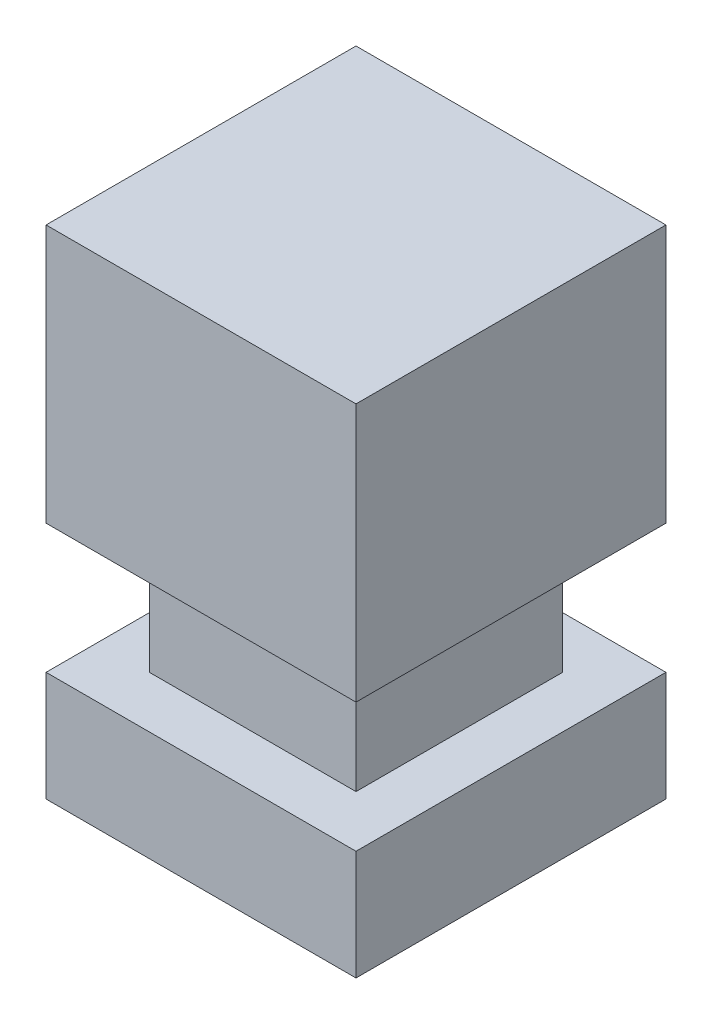
ISO-10303-21;
HEADER;
FILE_DESCRIPTION(('STEP AP214'),'2;1');
FILE_NAME('part.step','',(''),(''),'','','');
FILE_SCHEMA(('AUTOMOTIVE_DESIGN { 1 0 10303 214 1 1 1 1 }'));
ENDSEC;
DATA;
#1=APPLICATION_CONTEXT('core data for automotive mechanical design processes');
#2=APPLICATION_PROTOCOL_DEFINITION('international standard','automotive_design',2000,#1);
#3=PRODUCT_CONTEXT('',#1,'mechanical');
#4=PRODUCT('Part','Part','',(#3));
#5=PRODUCT_RELATED_PRODUCT_CATEGORY('part','',(#4));
#6=PRODUCT_DEFINITION_FORMATION('','',#4);
#7=PRODUCT_DEFINITION_CONTEXT('part definition',#1,'design');
#8=PRODUCT_DEFINITION('design','',#6,#7);
#9=PRODUCT_DEFINITION_SHAPE('','',#8);
#10=(LENGTH_UNIT() NAMED_UNIT(*) SI_UNIT(.MILLI.,.METRE.));
#11=(NAMED_UNIT(*) PLANE_ANGLE_UNIT() SI_UNIT($,.RADIAN.));
#12=(NAMED_UNIT(*) SI_UNIT($,.STERADIAN.) SOLID_ANGLE_UNIT());
#13=UNCERTAINTY_MEASURE_WITH_UNIT(LENGTH_MEASURE(1.E-05),#10,'distance_accuracy_value','');
#14=(GEOMETRIC_REPRESENTATION_CONTEXT(3) GLOBAL_UNCERTAINTY_ASSIGNED_CONTEXT((#13)) GLOBAL_UNIT_ASSIGNED_CONTEXT((#10,
#11,#12)) REPRESENTATION_CONTEXT('',''));
#15=CARTESIAN_POINT('',(0.,0.,0.));
#16=DIRECTION('',(0.,0.,1.));
#17=DIRECTION('',(1.,0.,0.));
#18=AXIS2_PLACEMENT_3D('',#15,#16,#17);
#19=CARTESIAN_POINT('',(-1.2,-3.85,1.2));
#20=DIRECTION('',(0.,0.,1.));
#21=DIRECTION('',(1.,0.,0.));
#22=AXIS2_PLACEMENT_3D('',#19,#20,#21);
#23=PLANE('',#22);
#24=DIRECTION('',(-1.,0.,0.));
#25=VECTOR('',#24,1.);
#26=CARTESIAN_POINT('',(-1.2,-2.,1.2));
#27=LINE('',#26,#25);
#28=CARTESIAN_POINT('',(1.2,-2.,1.2));
#29=VERTEX_POINT('',#28);
#30=CARTESIAN_POINT('',(-1.2,-2.,1.2));
#31=VERTEX_POINT('',#30);
#32=EDGE_CURVE('E234',#29,#31,#27,.T.);
#33=ORIENTED_EDGE('',*,*,#32,.F.);
#34=DIRECTION('',(0.,1.,0.));
#35=VECTOR('',#34,1.);
#36=CARTESIAN_POINT('',(1.2,-3.85,1.2));
#37=LINE('',#36,#35);
#38=CARTESIAN_POINT('',(1.2,0.,1.2));
#39=VERTEX_POINT('',#38);
#40=EDGE_CURVE('E52',#29,#39,#37,.T.);
#41=ORIENTED_EDGE('',*,*,#40,.T.);
#42=DIRECTION('',(1.,0.,0.));
#43=VECTOR('',#42,1.);
#44=CARTESIAN_POINT('',(-1.2,0.,1.2));
#45=LINE('',#44,#43);
#46=CARTESIAN_POINT('',(-1.2,0.,1.2));
#47=VERTEX_POINT('',#46);
#48=EDGE_CURVE('E171',#47,#39,#45,.T.);
#49=ORIENTED_EDGE('',*,*,#48,.F.);
#50=DIRECTION('',(0.,1.,0.));
#51=VECTOR('',#50,1.);
#52=CARTESIAN_POINT('',(-1.2,-3.85,1.2));
#53=LINE('',#52,#51);
#54=EDGE_CURVE('E203',#31,#47,#53,.T.);
#55=ORIENTED_EDGE('',*,*,#54,.F.);
#56=EDGE_LOOP('',(#33,#41,#49,#55));
#57=FACE_BOUND('',#56,.T.);
#58=ADVANCED_FACE('F42',(#57),#23,.T.);
#59=CARTESIAN_POINT('',(1.2,-3.85,1.2));
#60=VERTEX_POINT('',#59);
#61=CARTESIAN_POINT('',(1.2,-3.,1.2));
#62=VERTEX_POINT('',#61);
#63=EDGE_CURVE('E11',#60,#62,#37,.T.);
#64=ORIENTED_EDGE('',*,*,#63,.T.);
#65=DIRECTION('',(1.,0.,0.));
#66=VECTOR('',#65,1.);
#67=CARTESIAN_POINT('',(-1.2,-3.,1.2));
#68=LINE('',#67,#66);
#69=CARTESIAN_POINT('',(-1.2,-3.,1.2));
#70=VERTEX_POINT('',#69);
#71=EDGE_CURVE('E238',#70,#62,#68,.T.);
#72=ORIENTED_EDGE('',*,*,#71,.F.);
#73=CARTESIAN_POINT('',(-1.2,-3.85,1.2));
#74=VERTEX_POINT('',#73);
#75=EDGE_CURVE('E200',#74,#70,#53,.T.);
#76=ORIENTED_EDGE('',*,*,#75,.F.);
#77=DIRECTION('',(1.,0.,0.));
#78=VECTOR('',#77,1.);
#79=CARTESIAN_POINT('',(-1.2,-3.85,1.2));
#80=LINE('',#79,#78);
#81=EDGE_CURVE('E179',#74,#60,#80,.T.);
#82=ORIENTED_EDGE('',*,*,#81,.T.);
#83=EDGE_LOOP('',(#64,#72,#76,#82));
#84=FACE_BOUND('',#83,.T.);
#85=ADVANCED_FACE('F297',(#84),#23,.T.);
#86=CARTESIAN_POINT('',(-1.2,-3.85,-1.2));
#87=DIRECTION('',(0.,0.,-1.));
#88=DIRECTION('',(-1.,0.,0.));
#89=AXIS2_PLACEMENT_3D('',#86,#87,#88);
#90=PLANE('',#89);
#91=DIRECTION('',(0.,1.,0.));
#92=VECTOR('',#91,1.);
#93=CARTESIAN_POINT('',(1.2,-3.85,-1.2));
#94=LINE('',#93,#92);
#95=CARTESIAN_POINT('',(1.2,-2.,-1.2));
#96=VERTEX_POINT('',#95);
#97=CARTESIAN_POINT('',(1.2,0.,-1.2));
#98=VERTEX_POINT('',#97);
#99=EDGE_CURVE('E183',#96,#98,#94,.T.);
#100=ORIENTED_EDGE('',*,*,#99,.F.);
#101=DIRECTION('',(-1.,0.,0.));
#102=VECTOR('',#101,1.);
#103=CARTESIAN_POINT('',(-1.2,-2.,-1.2));
#104=LINE('',#103,#102);
#105=CARTESIAN_POINT('',(-1.2,-2.,-1.2));
#106=VERTEX_POINT('',#105);
#107=EDGE_CURVE('E243',#96,#106,#104,.T.);
#108=ORIENTED_EDGE('',*,*,#107,.T.);
#109=DIRECTION('',(0.,1.,0.));
#110=VECTOR('',#109,1.);
#111=CARTESIAN_POINT('',(-1.2,-3.85,-1.2));
#112=LINE('',#111,#110);
#113=CARTESIAN_POINT('',(-1.2,0.,-1.2));
#114=VERTEX_POINT('',#113);
#115=EDGE_CURVE('E207',#106,#114,#112,.T.);
#116=ORIENTED_EDGE('',*,*,#115,.T.);
#117=DIRECTION('',(-1.,0.,0.));
#118=VECTOR('',#117,1.);
#119=CARTESIAN_POINT('',(-1.2,0.,-1.2));
#120=LINE('',#119,#118);
#121=EDGE_CURVE('E188',#98,#114,#120,.T.);
#122=ORIENTED_EDGE('',*,*,#121,.F.);
#123=EDGE_LOOP('',(#100,#108,#116,#122));
#124=FACE_BOUND('',#123,.T.);
#125=ADVANCED_FACE('F226',(#124),#90,.T.);
#126=DIRECTION('',(1.,0.,0.));
#127=VECTOR('',#126,1.);
#128=CARTESIAN_POINT('',(-1.2,-3.,-1.2));
#129=LINE('',#128,#127);
#130=CARTESIAN_POINT('',(-1.2,-3.,-1.2));
#131=VERTEX_POINT('',#130);
#132=CARTESIAN_POINT('',(1.2,-3.,-1.2));
#133=VERTEX_POINT('',#132);
#134=EDGE_CURVE('E246',#131,#133,#129,.T.);
#135=ORIENTED_EDGE('',*,*,#134,.T.);
#136=CARTESIAN_POINT('',(1.2,-3.85,-1.2));
#137=VERTEX_POINT('',#136);
#138=EDGE_CURVE('E46',#137,#133,#94,.T.);
#139=ORIENTED_EDGE('',*,*,#138,.F.);
#140=DIRECTION('',(-1.,0.,0.));
#141=VECTOR('',#140,1.);
#142=CARTESIAN_POINT('',(-1.2,-3.85,-1.2));
#143=LINE('',#142,#141);
#144=CARTESIAN_POINT('',(-1.2,-3.85,-1.2));
#145=VERTEX_POINT('',#144);
#146=EDGE_CURVE('E170',#137,#145,#143,.T.);
#147=ORIENTED_EDGE('',*,*,#146,.T.);
#148=EDGE_CURVE('E204',#145,#131,#112,.T.);
#149=ORIENTED_EDGE('',*,*,#148,.T.);
#150=EDGE_LOOP('',(#135,#139,#147,#149));
#151=FACE_BOUND('',#150,.T.);
#152=ADVANCED_FACE('F292',(#151),#90,.T.);
#153=CARTESIAN_POINT('',(0.8,-2.,-1.2));
#154=DIRECTION('',(-1.,0.,0.));
#155=DIRECTION('',(0.,-1.,0.));
#156=AXIS2_PLACEMENT_3D('',#153,#154,#155);
#157=PLANE('',#156);
#158=DIRECTION('',(0.,-1.,0.));
#159=VECTOR('',#158,1.);
#160=CARTESIAN_POINT('',(0.8,-2.,-0.8));
#161=LINE('',#160,#159);
#162=CARTESIAN_POINT('',(0.8,-2.,-0.8));
#163=VERTEX_POINT('',#162);
#164=CARTESIAN_POINT('',(0.8,-3.,-0.8));
#165=VERTEX_POINT('',#164);
#166=EDGE_CURVE('E162',#163,#165,#161,.T.);
#167=ORIENTED_EDGE('',*,*,#166,.F.);
#168=DIRECTION('',(0.,0.,1.));
#169=VECTOR('',#168,1.);
#170=CARTESIAN_POINT('',(0.8,-2.,-1.2));
#171=LINE('',#170,#169);
#172=CARTESIAN_POINT('',(0.8,-2.,0.8));
#173=VERTEX_POINT('',#172);
#174=EDGE_CURVE('E150',#163,#173,#171,.T.);
#175=ORIENTED_EDGE('',*,*,#174,.T.);
#176=DIRECTION('',(0.,1.,0.));
#177=VECTOR('',#176,1.);
#178=CARTESIAN_POINT('',(0.8,-2.,0.8));
#179=LINE('',#178,#177);
#180=CARTESIAN_POINT('',(0.799999999999999,-3.,0.799999999999999));
#181=VERTEX_POINT('',#180);
#182=EDGE_CURVE('E135',#181,#173,#179,.T.);
#183=ORIENTED_EDGE('',*,*,#182,.F.);
#184=DIRECTION('',(0.,0.,1.));
#185=VECTOR('',#184,1.);
#186=CARTESIAN_POINT('',(0.799999999999999,-3.,-1.2));
#187=LINE('',#186,#185);
#188=EDGE_CURVE('E148',#165,#181,#187,.T.);
#189=ORIENTED_EDGE('',*,*,#188,.F.);
#190=EDGE_LOOP('',(#167,#175,#183,#189));
#191=FACE_BOUND('',#190,.T.);
#192=ADVANCED_FACE('F147',(#191),#157,.F.);
#193=CARTESIAN_POINT('',(-0.8,-2.,-1.2));
#194=DIRECTION('',(1.,0.,0.));
#195=DIRECTION('',(0.,1.,0.));
#196=AXIS2_PLACEMENT_3D('',#193,#194,#195);
#197=PLANE('',#196);
#198=DIRECTION('',(0.,1.,0.));
#199=VECTOR('',#198,1.);
#200=CARTESIAN_POINT('',(-0.8,-2.,-0.8));
#201=LINE('',#200,#199);
#202=CARTESIAN_POINT('',(-0.8,-3.,-0.8));
#203=VERTEX_POINT('',#202);
#204=CARTESIAN_POINT('',(-0.8,-2.,-0.8));
#205=VERTEX_POINT('',#204);
#206=EDGE_CURVE('E152',#203,#205,#201,.T.);
#207=ORIENTED_EDGE('',*,*,#206,.F.);
#208=DIRECTION('',(0.,0.,1.));
#209=VECTOR('',#208,1.);
#210=CARTESIAN_POINT('',(-0.8,-3.,-1.2));
#211=LINE('',#210,#209);
#212=CARTESIAN_POINT('',(-0.8,-3.,0.799999999999999));
#213=VERTEX_POINT('',#212);
#214=EDGE_CURVE('E252',#203,#213,#211,.T.);
#215=ORIENTED_EDGE('',*,*,#214,.T.);
#216=DIRECTION('',(0.,-1.,0.));
#217=VECTOR('',#216,1.);
#218=CARTESIAN_POINT('',(-0.8,-2.,0.8));
#219=LINE('',#218,#217);
#220=CARTESIAN_POINT('',(-0.8,-2.,0.8));
#221=VERTEX_POINT('',#220);
#222=EDGE_CURVE('E138',#221,#213,#219,.T.);
#223=ORIENTED_EDGE('',*,*,#222,.F.);
#224=DIRECTION('',(0.,0.,1.));
#225=VECTOR('',#224,1.);
#226=CARTESIAN_POINT('',(-0.8,-2.,-1.2));
#227=LINE('',#226,#225);
#228=EDGE_CURVE('E189',#205,#221,#227,.T.);
#229=ORIENTED_EDGE('',*,*,#228,.F.);
#230=EDGE_LOOP('',(#207,#215,#223,#229));
#231=FACE_BOUND('',#230,.T.);
#232=ADVANCED_FACE('F283',(#231),#197,.F.);
#233=CARTESIAN_POINT('',(1.2,-3.85,1.2));
#234=DIRECTION('',(1.,0.,0.));
#235=DIRECTION('',(0.,0.,-1.));
#236=AXIS2_PLACEMENT_3D('',#233,#234,#235);
#237=PLANE('',#236);
#238=DIRECTION('',(0.,0.,1.));
#239=VECTOR('',#238,1.);
#240=CARTESIAN_POINT('',(1.2,-2.,-1.2));
#241=LINE('',#240,#239);
#242=EDGE_CURVE('E160',#96,#29,#241,.T.);
#243=ORIENTED_EDGE('',*,*,#242,.F.);
#244=ORIENTED_EDGE('',*,*,#99,.T.);
#245=DIRECTION('',(0.,0.,-1.));
#246=VECTOR('',#245,1.);
#247=CARTESIAN_POINT('',(1.2,0.,1.2));
#248=LINE('',#247,#246);
#249=EDGE_CURVE('E184',#39,#98,#248,.T.);
#250=ORIENTED_EDGE('',*,*,#249,.F.);
#251=ORIENTED_EDGE('',*,*,#40,.F.);
#252=EDGE_LOOP('',(#243,#244,#250,#251));
#253=FACE_BOUND('',#252,.T.);
#254=ADVANCED_FACE('F224',(#253),#237,.T.);
#255=CARTESIAN_POINT('',(-1.2,-3.85,1.2));
#256=DIRECTION('',(-1.,0.,0.));
#257=DIRECTION('',(0.,0.,1.));
#258=AXIS2_PLACEMENT_3D('',#255,#256,#257);
#259=PLANE('',#258);
#260=DIRECTION('',(0.,0.,1.));
#261=VECTOR('',#260,1.);
#262=CARTESIAN_POINT('',(-1.2,-2.,-1.2));
#263=LINE('',#262,#261);
#264=EDGE_CURVE('E258',#106,#31,#263,.T.);
#265=ORIENTED_EDGE('',*,*,#264,.T.);
#266=ORIENTED_EDGE('',*,*,#54,.T.);
#267=DIRECTION('',(0.,0.,1.));
#268=VECTOR('',#267,1.);
#269=CARTESIAN_POINT('',(-1.2,0.,1.2));
#270=LINE('',#269,#268);
#271=EDGE_CURVE('E193',#114,#47,#270,.T.);
#272=ORIENTED_EDGE('',*,*,#271,.F.);
#273=ORIENTED_EDGE('',*,*,#115,.F.);
#274=EDGE_LOOP('',(#265,#266,#272,#273));
#275=FACE_BOUND('',#274,.T.);
#276=ADVANCED_FACE('F291',(#275),#259,.T.);
#277=DIRECTION('',(0.,0.,1.));
#278=VECTOR('',#277,1.);
#279=CARTESIAN_POINT('',(1.2,-3.,-1.2));
#280=LINE('',#279,#278);
#281=EDGE_CURVE('E156',#133,#62,#280,.T.);
#282=ORIENTED_EDGE('',*,*,#281,.T.);
#283=ORIENTED_EDGE('',*,*,#63,.F.);
#284=DIRECTION('',(0.,0.,-1.));
#285=VECTOR('',#284,1.);
#286=CARTESIAN_POINT('',(1.2,-3.85,1.2));
#287=LINE('',#286,#285);
#288=EDGE_CURVE('E166',#60,#137,#287,.T.);
#289=ORIENTED_EDGE('',*,*,#288,.T.);
#290=ORIENTED_EDGE('',*,*,#138,.T.);
#291=EDGE_LOOP('',(#282,#283,#289,#290));
#292=FACE_BOUND('',#291,.T.);
#293=ADVANCED_FACE('F44',(#292),#237,.T.);
#294=DIRECTION('',(0.,0.,1.));
#295=VECTOR('',#294,1.);
#296=CARTESIAN_POINT('',(-1.2,-3.,-1.2));
#297=LINE('',#296,#295);
#298=EDGE_CURVE('E255',#131,#70,#297,.T.);
#299=ORIENTED_EDGE('',*,*,#298,.F.);
#300=ORIENTED_EDGE('',*,*,#148,.F.);
#301=DIRECTION('',(0.,0.,1.));
#302=VECTOR('',#301,1.);
#303=CARTESIAN_POINT('',(-1.2,-3.85,1.2));
#304=LINE('',#303,#302);
#305=EDGE_CURVE('E175',#145,#74,#304,.T.);
#306=ORIENTED_EDGE('',*,*,#305,.T.);
#307=ORIENTED_EDGE('',*,*,#75,.T.);
#308=EDGE_LOOP('',(#299,#300,#306,#307));
#309=FACE_BOUND('',#308,.T.);
#310=ADVANCED_FACE('F307',(#309),#259,.T.);
#311=CARTESIAN_POINT('',(0.,-3.85,0.));
#312=DIRECTION('',(0.,-1.,0.));
#313=DIRECTION('',(0.,0.,-1.));
#314=AXIS2_PLACEMENT_3D('',#311,#312,#313);
#315=PLANE('',#314);
#316=ORIENTED_EDGE('',*,*,#288,.F.);
#317=ORIENTED_EDGE('',*,*,#81,.F.);
#318=ORIENTED_EDGE('',*,*,#305,.F.);
#319=ORIENTED_EDGE('',*,*,#146,.F.);
#320=EDGE_LOOP('',(#316,#317,#318,#319));
#321=FACE_BOUND('',#320,.T.);
#322=ADVANCED_FACE('F309',(#321),#315,.T.);
#323=CARTESIAN_POINT('',(0.,0.,0.));
#324=DIRECTION('',(0.,-1.,0.));
#325=DIRECTION('',(0.,0.,-1.));
#326=AXIS2_PLACEMENT_3D('',#323,#324,#325);
#327=PLANE('',#326);
#328=ORIENTED_EDGE('',*,*,#249,.T.);
#329=ORIENTED_EDGE('',*,*,#121,.T.);
#330=ORIENTED_EDGE('',*,*,#271,.T.);
#331=ORIENTED_EDGE('',*,*,#48,.T.);
#332=EDGE_LOOP('',(#328,#329,#330,#331));
#333=FACE_BOUND('',#332,.T.);
#334=ADVANCED_FACE('F228',(#333),#327,.F.);
#335=CARTESIAN_POINT('',(-1.2,-2.,-1.2));
#336=DIRECTION('',(0.,1.,0.));
#337=DIRECTION('',(-1.,0.,0.));
#338=AXIS2_PLACEMENT_3D('',#335,#336,#337);
#339=PLANE('',#338);
#340=ORIENTED_EDGE('',*,*,#174,.F.);
#341=DIRECTION('',(1.,0.,0.));
#342=VECTOR('',#341,1.);
#343=CARTESIAN_POINT('',(-1.2,-2.,-0.8));
#344=LINE('',#343,#342);
#345=EDGE_CURVE('E272',#205,#163,#344,.T.);
#346=ORIENTED_EDGE('',*,*,#345,.F.);
#347=ORIENTED_EDGE('',*,*,#228,.T.);
#348=DIRECTION('',(1.,0.,0.));
#349=VECTOR('',#348,1.);
#350=CARTESIAN_POINT('',(-1.2,-2.,0.8));
#351=LINE('',#350,#349);
#352=EDGE_CURVE('E141',#221,#173,#351,.T.);
#353=ORIENTED_EDGE('',*,*,#352,.T.);
#354=EDGE_LOOP('',(#340,#346,#347,#353));
#355=FACE_BOUND('',#354,.T.);
#356=ORIENTED_EDGE('',*,*,#32,.T.);
#357=ORIENTED_EDGE('',*,*,#264,.F.);
#358=ORIENTED_EDGE('',*,*,#107,.F.);
#359=ORIENTED_EDGE('',*,*,#242,.T.);
#360=EDGE_LOOP('',(#356,#357,#358,#359));
#361=FACE_BOUND('',#360,.T.);
#362=ADVANCED_FACE('F281',(#355,#361),#339,.F.);
#363=CARTESIAN_POINT('',(-1.2,-3.,-1.2));
#364=DIRECTION('',(0.,-1.,0.));
#365=DIRECTION('',(1.,0.,0.));
#366=AXIS2_PLACEMENT_3D('',#363,#364,#365);
#367=PLANE('',#366);
#368=ORIENTED_EDGE('',*,*,#71,.T.);
#369=ORIENTED_EDGE('',*,*,#281,.F.);
#370=ORIENTED_EDGE('',*,*,#134,.F.);
#371=ORIENTED_EDGE('',*,*,#298,.T.);
#372=EDGE_LOOP('',(#368,#369,#370,#371));
#373=FACE_BOUND('',#372,.T.);
#374=DIRECTION('',(1.,0.,0.));
#375=VECTOR('',#374,1.);
#376=CARTESIAN_POINT('',(-1.2,-3.,-0.8));
#377=LINE('',#376,#375);
#378=EDGE_CURVE('E68',#203,#165,#377,.T.);
#379=ORIENTED_EDGE('',*,*,#378,.T.);
#380=ORIENTED_EDGE('',*,*,#188,.T.);
#381=DIRECTION('',(1.,0.,0.));
#382=VECTOR('',#381,1.);
#383=CARTESIAN_POINT('',(-1.2,-3.,0.799999999999999));
#384=LINE('',#383,#382);
#385=EDGE_CURVE('E60',#213,#181,#384,.T.);
#386=ORIENTED_EDGE('',*,*,#385,.F.);
#387=ORIENTED_EDGE('',*,*,#214,.F.);
#388=EDGE_LOOP('',(#379,#380,#386,#387));
#389=FACE_BOUND('',#388,.T.);
#390=ADVANCED_FACE('F154',(#373,#389),#367,.F.);
#391=CARTESIAN_POINT('',(-1.2,-2.,0.8));
#392=DIRECTION('',(0.,0.,1.));
#393=DIRECTION('',(0.,-1.,0.));
#394=AXIS2_PLACEMENT_3D('',#391,#392,#393);
#395=PLANE('',#394);
#396=ORIENTED_EDGE('',*,*,#182,.T.);
#397=ORIENTED_EDGE('',*,*,#352,.F.);
#398=ORIENTED_EDGE('',*,*,#222,.T.);
#399=ORIENTED_EDGE('',*,*,#385,.T.);
#400=EDGE_LOOP('',(#396,#397,#398,#399));
#401=FACE_BOUND('',#400,.T.);
#402=ADVANCED_FACE('F134',(#401),#395,.T.);
#403=CARTESIAN_POINT('',(-1.2,-2.,-0.8));
#404=DIRECTION('',(0.,0.,-1.));
#405=DIRECTION('',(0.,1.,0.));
#406=AXIS2_PLACEMENT_3D('',#403,#404,#405);
#407=PLANE('',#406);
#408=ORIENTED_EDGE('',*,*,#166,.T.);
#409=ORIENTED_EDGE('',*,*,#378,.F.);
#410=ORIENTED_EDGE('',*,*,#206,.T.);
#411=ORIENTED_EDGE('',*,*,#345,.T.);
#412=EDGE_LOOP('',(#408,#409,#410,#411));
#413=FACE_BOUND('',#412,.T.);
#414=ADVANCED_FACE('F278',(#413),#407,.T.);
#415=CLOSED_SHELL('',(#58,#85,#125,#152,#192,#232,#254,#276,#293,#310,#322,#334,#362,#390,#402,#414));
#416=MANIFOLD_SOLID_BREP('B2',#415);
#417=ADVANCED_BREP_SHAPE_REPRESENTATION('',(#18,#416),#14);
#418=SHAPE_DEFINITION_REPRESENTATION(#9,#417);
ENDSEC;
END-ISO-10303-21;
